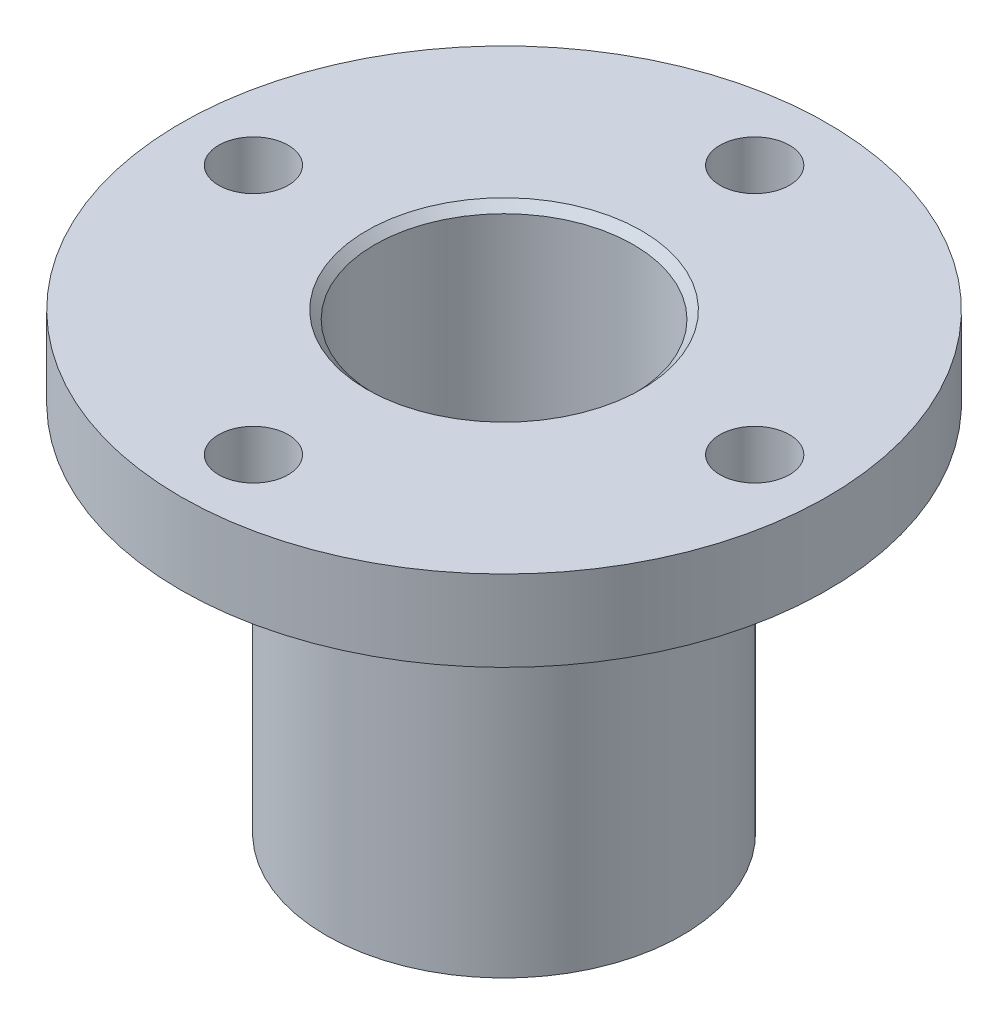
ISO-10303-21;
HEADER;
FILE_DESCRIPTION(('STEP AP214'),'2;1');
FILE_NAME('part.step','',(''),(''),'','','');
FILE_SCHEMA(('AUTOMOTIVE_DESIGN { 1 0 10303 214 1 1 1 1 }'));
ENDSEC;
DATA;
#1=APPLICATION_CONTEXT('core data for automotive mechanical design processes');
#2=APPLICATION_PROTOCOL_DEFINITION('international standard','automotive_design',2000,#1);
#3=PRODUCT_CONTEXT('',#1,'mechanical');
#4=PRODUCT('Part','Part','',(#3));
#5=PRODUCT_RELATED_PRODUCT_CATEGORY('part','',(#4));
#6=PRODUCT_DEFINITION_FORMATION('','',#4);
#7=PRODUCT_DEFINITION_CONTEXT('part definition',#1,'design');
#8=PRODUCT_DEFINITION('design','',#6,#7);
#9=PRODUCT_DEFINITION_SHAPE('','',#8);
#10=(LENGTH_UNIT() NAMED_UNIT(*) SI_UNIT(.MILLI.,.METRE.));
#11=(NAMED_UNIT(*) PLANE_ANGLE_UNIT() SI_UNIT($,.RADIAN.));
#12=(NAMED_UNIT(*) SI_UNIT($,.STERADIAN.) SOLID_ANGLE_UNIT());
#13=UNCERTAINTY_MEASURE_WITH_UNIT(LENGTH_MEASURE(1.E-05),#10,'distance_accuracy_value','');
#14=(GEOMETRIC_REPRESENTATION_CONTEXT(3) GLOBAL_UNCERTAINTY_ASSIGNED_CONTEXT((#13)) GLOBAL_UNIT_ASSIGNED_CONTEXT((#10,
#11,#12)) REPRESENTATION_CONTEXT('',''));
#15=CARTESIAN_POINT('',(0.,0.,0.));
#16=DIRECTION('',(0.,0.,1.));
#17=DIRECTION('',(1.,0.,0.));
#18=AXIS2_PLACEMENT_3D('',#15,#16,#17);
#19=CARTESIAN_POINT('',(0.,23.,0.));
#20=DIRECTION('',(0.,-1.,0.));
#21=DIRECTION('',(0.,0.,-1.));
#22=AXIS2_PLACEMENT_3D('',#19,#20,#21);
#23=CYLINDRICAL_SURFACE('',#22,11.);
#24=CARTESIAN_POINT('',(0.,23.,0.));
#25=DIRECTION('',(0.,1.,0.));
#26=DIRECTION('',(0.,0.,1.));
#27=AXIS2_PLACEMENT_3D('',#24,#25,#26);
#28=CIRCLE('',#27,11.);
#29=CARTESIAN_POINT('',(0.,23.,11.));
#30=VERTEX_POINT('',#29);
#31=EDGE_CURVE('E79',#30,#30,#28,.T.);
#32=ORIENTED_EDGE('',*,*,#31,.F.);
#33=EDGE_LOOP('',(#32));
#34=FACE_BOUND('',#33,.T.);
#35=CARTESIAN_POINT('',(0.,0.,0.));
#36=DIRECTION('',(0.,1.,0.));
#37=DIRECTION('',(0.,0.,1.));
#38=AXIS2_PLACEMENT_3D('',#35,#36,#37);
#39=CIRCLE('',#38,11.);
#40=CARTESIAN_POINT('',(0.,0.,11.));
#41=VERTEX_POINT('',#40);
#42=EDGE_CURVE('E76',#41,#41,#39,.T.);
#43=ORIENTED_EDGE('',*,*,#42,.T.);
#44=EDGE_LOOP('',(#43));
#45=FACE_BOUND('',#44,.T.);
#46=ADVANCED_FACE('F33',(#34,#45),#23,.T.);
#47=CARTESIAN_POINT('',(0.,0.,0.));
#48=DIRECTION('',(0.,1.,0.));
#49=DIRECTION('',(0.,0.,1.));
#50=AXIS2_PLACEMENT_3D('',#47,#48,#49);
#51=PLANE('',#50);
#52=CARTESIAN_POINT('',(0.,0.,0.));
#53=DIRECTION('',(0.,1.,0.));
#54=DIRECTION('',(0.,0.,1.));
#55=AXIS2_PLACEMENT_3D('',#52,#53,#54);
#56=CIRCLE('',#55,8.5);
#57=CARTESIAN_POINT('',(0.,0.,8.5));
#58=VERTEX_POINT('',#57);
#59=EDGE_CURVE('E82',#58,#58,#56,.T.);
#60=ORIENTED_EDGE('',*,*,#59,.T.);
#61=EDGE_LOOP('',(#60));
#62=FACE_BOUND('',#61,.T.);
#63=ORIENTED_EDGE('',*,*,#42,.F.);
#64=EDGE_LOOP('',(#63));
#65=FACE_BOUND('',#64,.T.);
#66=ADVANCED_FACE('F103',(#62,#65),#51,.F.);
#67=CARTESIAN_POINT('',(0.,28.,0.));
#68=DIRECTION('',(0.,-1.,0.));
#69=DIRECTION('',(0.,0.,-1.));
#70=AXIS2_PLACEMENT_3D('',#67,#68,#69);
#71=CYLINDRICAL_SURFACE('',#70,20.);
#72=CARTESIAN_POINT('',(0.,28.,0.));
#73=DIRECTION('',(0.,1.,0.));
#74=DIRECTION('',(0.,0.,1.));
#75=AXIS2_PLACEMENT_3D('',#72,#73,#74);
#76=CIRCLE('',#75,20.);
#77=CARTESIAN_POINT('',(0.,28.,20.));
#78=VERTEX_POINT('',#77);
#79=EDGE_CURVE('E73',#78,#78,#76,.T.);
#80=ORIENTED_EDGE('',*,*,#79,.F.);
#81=EDGE_LOOP('',(#80));
#82=FACE_BOUND('',#81,.T.);
#83=CARTESIAN_POINT('',(0.,23.,0.));
#84=DIRECTION('',(0.,1.,0.));
#85=DIRECTION('',(0.,0.,1.));
#86=AXIS2_PLACEMENT_3D('',#83,#84,#85);
#87=CIRCLE('',#86,20.);
#88=CARTESIAN_POINT('',(0.,23.,20.));
#89=VERTEX_POINT('',#88);
#90=EDGE_CURVE('E53',#89,#89,#87,.T.);
#91=ORIENTED_EDGE('',*,*,#90,.T.);
#92=EDGE_LOOP('',(#91));
#93=FACE_BOUND('',#92,.T.);
#94=ADVANCED_FACE('F109',(#82,#93),#71,.T.);
#95=CARTESIAN_POINT('',(0.,28.,0.));
#96=DIRECTION('',(0.,1.,0.));
#97=DIRECTION('',(0.,0.,1.));
#98=AXIS2_PLACEMENT_3D('',#95,#96,#97);
#99=PLANE('',#98);
#100=CARTESIAN_POINT('',(15.5000000000004,28.,-4.38638293632584E-13));
#101=DIRECTION('',(0.,1.,0.));
#102=DIRECTION('',(0.,0.,1.));
#103=AXIS2_PLACEMENT_3D('',#100,#101,#102);
#104=CIRCLE('',#103,2.15000000000034);
#105=CARTESIAN_POINT('',(15.5000000000004,28.,2.1499999999999));
#106=VERTEX_POINT('',#105);
#107=EDGE_CURVE('E58',#106,#106,#104,.T.);
#108=ORIENTED_EDGE('',*,*,#107,.F.);
#109=EDGE_LOOP('',(#108));
#110=FACE_BOUND('',#109,.T.);
#111=CARTESIAN_POINT('',(8.77276587265167E-13,28.,15.5));
#112=DIRECTION('',(0.,1.,0.));
#113=DIRECTION('',(0.,0.,1.));
#114=AXIS2_PLACEMENT_3D('',#111,#112,#113);
#115=CIRCLE('',#114,2.15000000000094);
#116=CARTESIAN_POINT('',(8.77276587265167E-13,28.,17.6500000000009));
#117=VERTEX_POINT('',#116);
#118=EDGE_CURVE('E143',#117,#117,#115,.T.);
#119=ORIENTED_EDGE('',*,*,#118,.F.);
#120=EDGE_LOOP('',(#119));
#121=FACE_BOUND('',#120,.T.);
#122=CARTESIAN_POINT('',(-15.4999999999996,28.,4.40536496171262E-13));
#123=DIRECTION('',(0.,1.,0.));
#124=DIRECTION('',(0.,0.,1.));
#125=AXIS2_PLACEMENT_3D('',#122,#123,#124);
#126=CIRCLE('',#125,2.1500000000007);
#127=CARTESIAN_POINT('',(-15.4999999999996,28.,2.15000000000115));
#128=VERTEX_POINT('',#127);
#129=EDGE_CURVE('E71',#128,#128,#126,.T.);
#130=ORIENTED_EDGE('',*,*,#129,.F.);
#131=EDGE_LOOP('',(#130));
#132=FACE_BOUND('',#131,.T.);
#133=CARTESIAN_POINT('',(0.,28.,-15.5));
#134=DIRECTION('',(0.,1.,0.));
#135=DIRECTION('',(0.,0.,1.));
#136=AXIS2_PLACEMENT_3D('',#133,#134,#135);
#137=CIRCLE('',#136,2.15);
#138=CARTESIAN_POINT('',(0.,28.,-13.35));
#139=VERTEX_POINT('',#138);
#140=EDGE_CURVE('E54',#139,#139,#137,.T.);
#141=ORIENTED_EDGE('',*,*,#140,.F.);
#142=EDGE_LOOP('',(#141));
#143=FACE_BOUND('',#142,.T.);
#144=CARTESIAN_POINT('',(0.,28.,0.));
#145=DIRECTION('',(0.,1.,0.));
#146=DIRECTION('',(0.,0.,1.));
#147=AXIS2_PLACEMENT_3D('',#144,#145,#146);
#148=CIRCLE('',#147,8.50000000000001);
#149=CARTESIAN_POINT('',(0.,28.,8.50000000000001));
#150=VERTEX_POINT('',#149);
#151=EDGE_CURVE('E10',#150,#150,#148,.F.);
#152=ORIENTED_EDGE('',*,*,#151,.T.);
#153=EDGE_LOOP('',(#152));
#154=FACE_BOUND('',#153,.T.);
#155=ORIENTED_EDGE('',*,*,#79,.T.);
#156=EDGE_LOOP('',(#155));
#157=FACE_BOUND('',#156,.T.);
#158=ADVANCED_FACE('F117',(#110,#121,#132,#143,#154,#157),#99,.T.);
#159=CARTESIAN_POINT('',(0.,23.,0.));
#160=DIRECTION('',(0.,1.,0.));
#161=DIRECTION('',(0.,0.,1.));
#162=AXIS2_PLACEMENT_3D('',#159,#160,#161);
#163=PLANE('',#162);
#164=CARTESIAN_POINT('',(15.5000000000004,23.,-4.38638293632584E-13));
#165=DIRECTION('',(0.,1.,0.));
#166=DIRECTION('',(0.,0.,1.));
#167=AXIS2_PLACEMENT_3D('',#164,#165,#166);
#168=CIRCLE('',#167,2.15000000000034);
#169=CARTESIAN_POINT('',(15.5000000000004,23.,2.1499999999999));
#170=VERTEX_POINT('',#169);
#171=EDGE_CURVE('E37',#170,#170,#168,.T.);
#172=ORIENTED_EDGE('',*,*,#171,.T.);
#173=EDGE_LOOP('',(#172));
#174=FACE_BOUND('',#173,.T.);
#175=CARTESIAN_POINT('',(8.77276587265167E-13,23.,15.5));
#176=DIRECTION('',(0.,1.,0.));
#177=DIRECTION('',(0.,0.,1.));
#178=AXIS2_PLACEMENT_3D('',#175,#176,#177);
#179=CIRCLE('',#178,2.15000000000094);
#180=CARTESIAN_POINT('',(8.77276587265167E-13,23.,17.6500000000009));
#181=VERTEX_POINT('',#180);
#182=EDGE_CURVE('E57',#181,#181,#179,.T.);
#183=ORIENTED_EDGE('',*,*,#182,.T.);
#184=EDGE_LOOP('',(#183));
#185=FACE_BOUND('',#184,.T.);
#186=CARTESIAN_POINT('',(-15.4999999999996,23.,4.40536496171262E-13));
#187=DIRECTION('',(0.,1.,0.));
#188=DIRECTION('',(0.,0.,1.));
#189=AXIS2_PLACEMENT_3D('',#186,#187,#188);
#190=CIRCLE('',#189,2.1500000000007);
#191=CARTESIAN_POINT('',(-15.4999999999996,23.,2.15000000000115));
#192=VERTEX_POINT('',#191);
#193=EDGE_CURVE('E55',#192,#192,#190,.T.);
#194=ORIENTED_EDGE('',*,*,#193,.T.);
#195=EDGE_LOOP('',(#194));
#196=FACE_BOUND('',#195,.T.);
#197=CARTESIAN_POINT('',(0.,23.,-15.5));
#198=DIRECTION('',(0.,1.,0.));
#199=DIRECTION('',(0.,0.,1.));
#200=AXIS2_PLACEMENT_3D('',#197,#198,#199);
#201=CIRCLE('',#200,2.15);
#202=CARTESIAN_POINT('',(0.,23.,-13.35));
#203=VERTEX_POINT('',#202);
#204=EDGE_CURVE('E50',#203,#203,#201,.T.);
#205=ORIENTED_EDGE('',*,*,#204,.T.);
#206=EDGE_LOOP('',(#205));
#207=FACE_BOUND('',#206,.T.);
#208=ORIENTED_EDGE('',*,*,#31,.T.);
#209=EDGE_LOOP('',(#208));
#210=FACE_BOUND('',#209,.T.);
#211=ORIENTED_EDGE('',*,*,#90,.F.);
#212=EDGE_LOOP('',(#211));
#213=FACE_BOUND('',#212,.T.);
#214=ADVANCED_FACE('F119',(#174,#185,#196,#207,#210,#213),#163,.F.);
#215=CARTESIAN_POINT('',(0.,0.,0.));
#216=DIRECTION('',(0.,1.,0.));
#217=DIRECTION('',(0.,0.,1.));
#218=AXIS2_PLACEMENT_3D('',#215,#216,#217);
#219=CYLINDRICAL_SURFACE('',#218,8.);
#220=CARTESIAN_POINT('',(0.,0.500000000000002,0.));
#221=DIRECTION('',(0.,1.,0.));
#222=DIRECTION('',(0.,0.,1.));
#223=AXIS2_PLACEMENT_3D('',#220,#221,#222);
#224=CIRCLE('',#223,8.);
#225=CARTESIAN_POINT('',(0.,0.500000000000002,8.));
#226=VERTEX_POINT('',#225);
#227=EDGE_CURVE('E41',#226,#226,#224,.F.);
#228=ORIENTED_EDGE('',*,*,#227,.T.);
#229=EDGE_LOOP('',(#228));
#230=FACE_BOUND('',#229,.T.);
#231=CARTESIAN_POINT('',(0.,27.5,0.));
#232=DIRECTION('',(0.,1.,0.));
#233=DIRECTION('',(0.,0.,1.));
#234=AXIS2_PLACEMENT_3D('',#231,#232,#233);
#235=CIRCLE('',#234,8.);
#236=CARTESIAN_POINT('',(0.,27.5,8.));
#237=VERTEX_POINT('',#236);
#238=EDGE_CURVE('E46',#237,#237,#235,.T.);
#239=ORIENTED_EDGE('',*,*,#238,.T.);
#240=EDGE_LOOP('',(#239));
#241=FACE_BOUND('',#240,.T.);
#242=ADVANCED_FACE('F89',(#230,#241),#219,.F.);
#243=CARTESIAN_POINT('',(0.,0.,0.));
#244=DIRECTION('',(0.,-1.,0.));
#245=DIRECTION('',(0.,0.,-1.));
#246=AXIS2_PLACEMENT_3D('',#243,#244,#245);
#247=CONICAL_SURFACE('',#246,8.5,0.785398163397448);
#248=ORIENTED_EDGE('',*,*,#227,.F.);
#249=EDGE_LOOP('',(#248));
#250=FACE_BOUND('',#249,.T.);
#251=ORIENTED_EDGE('',*,*,#59,.F.);
#252=EDGE_LOOP('',(#251));
#253=FACE_BOUND('',#252,.T.);
#254=ADVANCED_FACE('F93',(#250,#253),#247,.F.);
#255=CARTESIAN_POINT('',(0.,27.5,0.));
#256=DIRECTION('',(0.,1.,0.));
#257=DIRECTION('',(0.,0.,1.));
#258=AXIS2_PLACEMENT_3D('',#255,#256,#257);
#259=CONICAL_SURFACE('',#258,8.,0.78539816339745);
#260=ORIENTED_EDGE('',*,*,#151,.F.);
#261=EDGE_LOOP('',(#260));
#262=FACE_BOUND('',#261,.T.);
#263=ORIENTED_EDGE('',*,*,#238,.F.);
#264=EDGE_LOOP('',(#263));
#265=FACE_BOUND('',#264,.T.);
#266=ADVANCED_FACE('F35',(#262,#265),#259,.F.);
#267=CARTESIAN_POINT('',(0.,0.,-15.5));
#268=DIRECTION('',(0.,1.,0.));
#269=DIRECTION('',(0.,0.,1.));
#270=AXIS2_PLACEMENT_3D('',#267,#268,#269);
#271=CYLINDRICAL_SURFACE('',#270,2.15);
#272=ORIENTED_EDGE('',*,*,#140,.T.);
#273=EDGE_LOOP('',(#272));
#274=FACE_BOUND('',#273,.T.);
#275=ORIENTED_EDGE('',*,*,#204,.F.);
#276=EDGE_LOOP('',(#275));
#277=FACE_BOUND('',#276,.T.);
#278=ADVANCED_FACE('F92',(#274,#277),#271,.F.);
#279=CARTESIAN_POINT('',(-15.4999999999996,0.,4.40536496171262E-13));
#280=DIRECTION('',(0.,1.,0.));
#281=DIRECTION('',(0.,0.,1.));
#282=AXIS2_PLACEMENT_3D('',#279,#280,#281);
#283=CYLINDRICAL_SURFACE('',#282,2.1500000000007);
#284=ORIENTED_EDGE('',*,*,#129,.T.);
#285=EDGE_LOOP('',(#284));
#286=FACE_BOUND('',#285,.T.);
#287=ORIENTED_EDGE('',*,*,#193,.F.);
#288=EDGE_LOOP('',(#287));
#289=FACE_BOUND('',#288,.T.);
#290=ADVANCED_FACE('F99',(#286,#289),#283,.F.);
#291=CARTESIAN_POINT('',(8.77276587265167E-13,0.,15.5));
#292=DIRECTION('',(0.,1.,0.));
#293=DIRECTION('',(0.,0.,1.));
#294=AXIS2_PLACEMENT_3D('',#291,#292,#293);
#295=CYLINDRICAL_SURFACE('',#294,2.15000000000094);
#296=ORIENTED_EDGE('',*,*,#118,.T.);
#297=EDGE_LOOP('',(#296));
#298=FACE_BOUND('',#297,.T.);
#299=ORIENTED_EDGE('',*,*,#182,.F.);
#300=EDGE_LOOP('',(#299));
#301=FACE_BOUND('',#300,.T.);
#302=ADVANCED_FACE('F130',(#298,#301),#295,.F.);
#303=CARTESIAN_POINT('',(15.5000000000004,0.,-4.38638293632584E-13));
#304=DIRECTION('',(0.,1.,0.));
#305=DIRECTION('',(0.,0.,1.));
#306=AXIS2_PLACEMENT_3D('',#303,#304,#305);
#307=CYLINDRICAL_SURFACE('',#306,2.15000000000034);
#308=ORIENTED_EDGE('',*,*,#107,.T.);
#309=EDGE_LOOP('',(#308));
#310=FACE_BOUND('',#309,.T.);
#311=ORIENTED_EDGE('',*,*,#171,.F.);
#312=EDGE_LOOP('',(#311));
#313=FACE_BOUND('',#312,.T.);
#314=ADVANCED_FACE('F134',(#310,#313),#307,.F.);
#315=CLOSED_SHELL('',(#46,#66,#94,#158,#214,#242,#254,#266,#278,#290,#302,#314));
#316=MANIFOLD_SOLID_BREP('B2',#315);
#317=ADVANCED_BREP_SHAPE_REPRESENTATION('',(#18,#316),#14);
#318=SHAPE_DEFINITION_REPRESENTATION(#9,#317);
ENDSEC;
END-ISO-10303-21;
